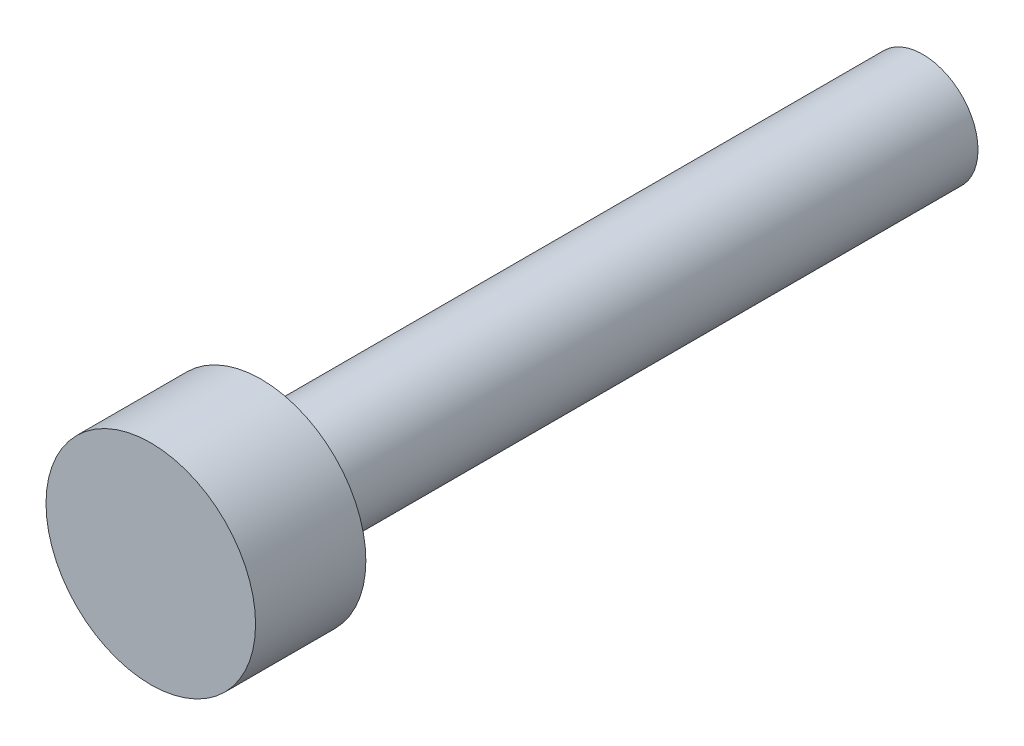
ISO-10303-21;
HEADER;
FILE_DESCRIPTION(('STEP AP214'),'2;1');
FILE_NAME('part.step','',(''),(''),'','','');
FILE_SCHEMA(('AUTOMOTIVE_DESIGN { 1 0 10303 214 1 1 1 1 }'));
ENDSEC;
DATA;
#1=APPLICATION_CONTEXT('core data for automotive mechanical design processes');
#2=APPLICATION_PROTOCOL_DEFINITION('international standard','automotive_design',2000,#1);
#3=PRODUCT_CONTEXT('',#1,'mechanical');
#4=PRODUCT('Part','Part','',(#3));
#5=PRODUCT_RELATED_PRODUCT_CATEGORY('part','',(#4));
#6=PRODUCT_DEFINITION_FORMATION('','',#4);
#7=PRODUCT_DEFINITION_CONTEXT('part definition',#1,'design');
#8=PRODUCT_DEFINITION('design','',#6,#7);
#9=PRODUCT_DEFINITION_SHAPE('','',#8);
#10=(LENGTH_UNIT() NAMED_UNIT(*) SI_UNIT(.MILLI.,.METRE.));
#11=(NAMED_UNIT(*) PLANE_ANGLE_UNIT() SI_UNIT($,.RADIAN.));
#12=(NAMED_UNIT(*) SI_UNIT($,.STERADIAN.) SOLID_ANGLE_UNIT());
#13=UNCERTAINTY_MEASURE_WITH_UNIT(LENGTH_MEASURE(1.E-05),#10,'distance_accuracy_value','');
#14=(GEOMETRIC_REPRESENTATION_CONTEXT(3) GLOBAL_UNCERTAINTY_ASSIGNED_CONTEXT((#13)) GLOBAL_UNIT_ASSIGNED_CONTEXT((#10,
#11,#12)) REPRESENTATION_CONTEXT('',''));
#15=CARTESIAN_POINT('',(0.,0.,0.));
#16=DIRECTION('',(0.,0.,1.));
#17=DIRECTION('',(1.,0.,0.));
#18=AXIS2_PLACEMENT_3D('',#15,#16,#17);
#19=CARTESIAN_POINT('',(0.,0.,0.));
#20=DIRECTION('',(0.,0.,-1.));
#21=DIRECTION('',(-1.,0.,0.));
#22=AXIS2_PLACEMENT_3D('',#19,#20,#21);
#23=CYLINDRICAL_SURFACE('',#22,1.);
#24=CARTESIAN_POINT('',(0.,0.,0.));
#25=DIRECTION('',(0.,0.,1.));
#26=DIRECTION('',(1.,0.,0.));
#27=AXIS2_PLACEMENT_3D('',#24,#25,#26);
#28=CIRCLE('',#27,1.);
#29=CARTESIAN_POINT('',(1.,0.,0.));
#30=VERTEX_POINT('',#29);
#31=EDGE_CURVE('E10',#30,#30,#28,.T.);
#32=ORIENTED_EDGE('',*,*,#31,.F.);
#33=EDGE_LOOP('',(#32));
#34=FACE_BOUND('',#33,.T.);
#35=CARTESIAN_POINT('',(0.,0.,-12.));
#36=DIRECTION('',(0.,0.,1.));
#37=DIRECTION('',(1.,0.,0.));
#38=AXIS2_PLACEMENT_3D('',#35,#36,#37);
#39=CIRCLE('',#38,1.);
#40=CARTESIAN_POINT('',(1.,0.,-12.));
#41=VERTEX_POINT('',#40);
#42=EDGE_CURVE('E37',#41,#41,#39,.T.);
#43=ORIENTED_EDGE('',*,*,#42,.T.);
#44=EDGE_LOOP('',(#43));
#45=FACE_BOUND('',#44,.T.);
#46=ADVANCED_FACE('F40',(#34,#45),#23,.T.);
#47=CARTESIAN_POINT('',(0.,0.,-12.));
#48=DIRECTION('',(0.,0.,1.));
#49=DIRECTION('',(1.,0.,0.));
#50=AXIS2_PLACEMENT_3D('',#47,#48,#49);
#51=PLANE('',#50);
#52=ORIENTED_EDGE('',*,*,#42,.F.);
#53=EDGE_LOOP('',(#52));
#54=FACE_BOUND('',#53,.T.);
#55=ADVANCED_FACE('F58',(#54),#51,.F.);
#56=CARTESIAN_POINT('',(0.,0.,2.));
#57=DIRECTION('',(0.,0.,-1.));
#58=DIRECTION('',(-1.,0.,0.));
#59=AXIS2_PLACEMENT_3D('',#56,#57,#58);
#60=CYLINDRICAL_SURFACE('',#59,1.9);
#61=CARTESIAN_POINT('',(0.,0.,2.));
#62=DIRECTION('',(0.,0.,1.));
#63=DIRECTION('',(1.,0.,0.));
#64=AXIS2_PLACEMENT_3D('',#61,#62,#63);
#65=CIRCLE('',#64,1.9);
#66=CARTESIAN_POINT('',(1.9,0.,2.));
#67=VERTEX_POINT('',#66);
#68=EDGE_CURVE('E50',#67,#67,#65,.T.);
#69=ORIENTED_EDGE('',*,*,#68,.F.);
#70=EDGE_LOOP('',(#69));
#71=FACE_BOUND('',#70,.T.);
#72=CARTESIAN_POINT('',(0.,0.,0.));
#73=DIRECTION('',(0.,0.,1.));
#74=DIRECTION('',(1.,0.,0.));
#75=AXIS2_PLACEMENT_3D('',#72,#73,#74);
#76=CIRCLE('',#75,1.9);
#77=CARTESIAN_POINT('',(1.9,0.,0.));
#78=VERTEX_POINT('',#77);
#79=EDGE_CURVE('E47',#78,#78,#76,.T.);
#80=ORIENTED_EDGE('',*,*,#79,.T.);
#81=EDGE_LOOP('',(#80));
#82=FACE_BOUND('',#81,.T.);
#83=ADVANCED_FACE('F60',(#71,#82),#60,.T.);
#84=CARTESIAN_POINT('',(0.,0.,2.));
#85=DIRECTION('',(0.,0.,1.));
#86=DIRECTION('',(1.,0.,0.));
#87=AXIS2_PLACEMENT_3D('',#84,#85,#86);
#88=PLANE('',#87);
#89=ORIENTED_EDGE('',*,*,#68,.T.);
#90=EDGE_LOOP('',(#89));
#91=FACE_BOUND('',#90,.T.);
#92=ADVANCED_FACE('F54',(#91),#88,.T.);
#93=CARTESIAN_POINT('',(0.,0.,0.));
#94=DIRECTION('',(0.,0.,1.));
#95=DIRECTION('',(1.,0.,0.));
#96=AXIS2_PLACEMENT_3D('',#93,#94,#95);
#97=PLANE('',#96);
#98=ORIENTED_EDGE('',*,*,#31,.T.);
#99=EDGE_LOOP('',(#98));
#100=FACE_BOUND('',#99,.T.);
#101=ORIENTED_EDGE('',*,*,#79,.F.);
#102=EDGE_LOOP('',(#101));
#103=FACE_BOUND('',#102,.T.);
#104=ADVANCED_FACE('F62',(#100,#103),#97,.F.);
#105=CLOSED_SHELL('',(#46,#55,#83,#92,#104));
#106=MANIFOLD_SOLID_BREP('B2',#105);
#107=ADVANCED_BREP_SHAPE_REPRESENTATION('',(#18,#106),#14);
#108=SHAPE_DEFINITION_REPRESENTATION(#9,#107);
ENDSEC;
END-ISO-10303-21;
